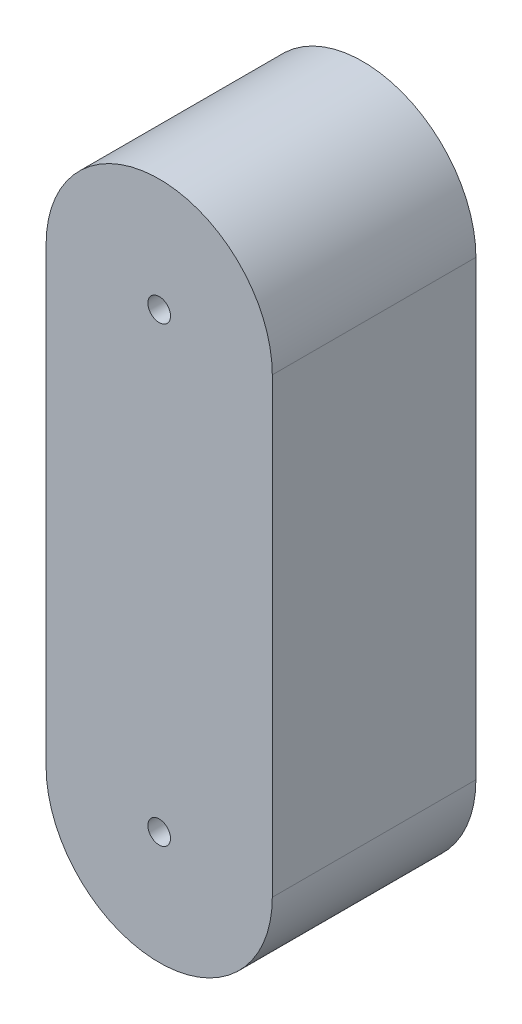
ISO-10303-21;
HEADER;
FILE_DESCRIPTION(('STEP AP214'),'2;1');
FILE_NAME('part.step','',(''),(''),'','','');
FILE_SCHEMA(('AUTOMOTIVE_DESIGN { 1 0 10303 214 1 1 1 1 }'));
ENDSEC;
DATA;
#1=APPLICATION_CONTEXT('core data for automotive mechanical design processes');
#2=APPLICATION_PROTOCOL_DEFINITION('international standard','automotive_design',2000,#1);
#3=PRODUCT_CONTEXT('',#1,'mechanical');
#4=PRODUCT('Part','Part','',(#3));
#5=PRODUCT_RELATED_PRODUCT_CATEGORY('part','',(#4));
#6=PRODUCT_DEFINITION_FORMATION('','',#4);
#7=PRODUCT_DEFINITION_CONTEXT('part definition',#1,'design');
#8=PRODUCT_DEFINITION('design','',#6,#7);
#9=PRODUCT_DEFINITION_SHAPE('','',#8);
#10=(LENGTH_UNIT() NAMED_UNIT(*) SI_UNIT(.MILLI.,.METRE.));
#11=(NAMED_UNIT(*) PLANE_ANGLE_UNIT() SI_UNIT($,.RADIAN.));
#12=(NAMED_UNIT(*) SI_UNIT($,.STERADIAN.) SOLID_ANGLE_UNIT());
#13=UNCERTAINTY_MEASURE_WITH_UNIT(LENGTH_MEASURE(1.E-05),#10,'distance_accuracy_value','');
#14=(GEOMETRIC_REPRESENTATION_CONTEXT(3) GLOBAL_UNCERTAINTY_ASSIGNED_CONTEXT((#13)) GLOBAL_UNIT_ASSIGNED_CONTEXT((#10,
#11,#12)) REPRESENTATION_CONTEXT('',''));
#15=CARTESIAN_POINT('',(0.,0.,0.));
#16=DIRECTION('',(0.,0.,1.));
#17=DIRECTION('',(1.,0.,0.));
#18=AXIS2_PLACEMENT_3D('',#15,#16,#17);
#19=CARTESIAN_POINT('',(0.,200.,90.));
#20=DIRECTION('',(0.,0.,1.));
#21=DIRECTION('',(1.,0.,0.));
#22=AXIS2_PLACEMENT_3D('',#19,#20,#21);
#23=PLANE('',#22);
#24=CARTESIAN_POINT('',(0.,0.,90.));
#25=DIRECTION('',(0.,0.,1.));
#26=DIRECTION('',(1.,0.,0.));
#27=AXIS2_PLACEMENT_3D('',#24,#25,#26);
#28=CIRCLE('',#27,5.);
#29=CARTESIAN_POINT('',(-5.,0.,90.));
#30=VERTEX_POINT('',#29);
#31=EDGE_CURVE('E106',#30,#30,#28,.T.);
#32=ORIENTED_EDGE('',*,*,#31,.F.);
#33=EDGE_LOOP('',(#32));
#34=FACE_BOUND('',#33,.T.);
#35=CARTESIAN_POINT('',(0.,200.,90.));
#36=DIRECTION('',(0.,0.,1.));
#37=DIRECTION('',(1.,0.,0.));
#38=AXIS2_PLACEMENT_3D('',#35,#36,#37);
#39=CIRCLE('',#38,50.);
#40=CARTESIAN_POINT('',(50.,200.,90.));
#41=VERTEX_POINT('',#40);
#42=CARTESIAN_POINT('',(-50.,200.,90.));
#43=VERTEX_POINT('',#42);
#44=EDGE_CURVE('E91',#41,#43,#39,.T.);
#45=ORIENTED_EDGE('',*,*,#44,.T.);
#46=DIRECTION('',(0.,-1.,0.));
#47=VECTOR('',#46,1.);
#48=CARTESIAN_POINT('',(-50.,200.,90.));
#49=LINE('',#48,#47);
#50=CARTESIAN_POINT('',(-50.,0.,90.));
#51=VERTEX_POINT('',#50);
#52=EDGE_CURVE('E86',#43,#51,#49,.T.);
#53=ORIENTED_EDGE('',*,*,#52,.T.);
#54=CARTESIAN_POINT('',(0.,0.,90.));
#55=DIRECTION('',(0.,0.,1.));
#56=DIRECTION('',(1.,0.,0.));
#57=AXIS2_PLACEMENT_3D('',#54,#55,#56);
#58=CIRCLE('',#57,50.);
#59=CARTESIAN_POINT('',(50.,0.,90.));
#60=VERTEX_POINT('',#59);
#61=EDGE_CURVE('E89',#51,#60,#58,.T.);
#62=ORIENTED_EDGE('',*,*,#61,.T.);
#63=DIRECTION('',(0.,1.,0.));
#64=VECTOR('',#63,1.);
#65=CARTESIAN_POINT('',(50.,0.,90.));
#66=LINE('',#65,#64);
#67=EDGE_CURVE('E56',#60,#41,#66,.T.);
#68=ORIENTED_EDGE('',*,*,#67,.T.);
#69=EDGE_LOOP('',(#45,#53,#62,#68));
#70=FACE_BOUND('',#69,.T.);
#71=CARTESIAN_POINT('',(0.,200.,90.));
#72=DIRECTION('',(0.,0.,1.));
#73=DIRECTION('',(1.,0.,0.));
#74=AXIS2_PLACEMENT_3D('',#71,#72,#73);
#75=CIRCLE('',#74,5.);
#76=CARTESIAN_POINT('',(-5.,200.,90.));
#77=VERTEX_POINT('',#76);
#78=EDGE_CURVE('E121',#77,#77,#75,.T.);
#79=ORIENTED_EDGE('',*,*,#78,.F.);
#80=EDGE_LOOP('',(#79));
#81=FACE_BOUND('',#80,.T.);
#82=ADVANCED_FACE('F39',(#34,#70,#81),#23,.T.);
#83=CARTESIAN_POINT('',(0.,200.,0.));
#84=DIRECTION('',(0.,0.,1.));
#85=DIRECTION('',(1.,0.,0.));
#86=AXIS2_PLACEMENT_3D('',#83,#84,#85);
#87=PLANE('',#86);
#88=CARTESIAN_POINT('',(0.,200.,0.));
#89=DIRECTION('',(0.,0.,1.));
#90=DIRECTION('',(1.,0.,0.));
#91=AXIS2_PLACEMENT_3D('',#88,#89,#90);
#92=CIRCLE('',#91,50.);
#93=CARTESIAN_POINT('',(50.,200.,0.));
#94=VERTEX_POINT('',#93);
#95=CARTESIAN_POINT('',(-50.,200.,0.));
#96=VERTEX_POINT('',#95);
#97=EDGE_CURVE('E103',#94,#96,#92,.T.);
#98=ORIENTED_EDGE('',*,*,#97,.F.);
#99=DIRECTION('',(0.,1.,0.));
#100=VECTOR('',#99,1.);
#101=CARTESIAN_POINT('',(50.,0.,0.));
#102=LINE('',#101,#100);
#103=CARTESIAN_POINT('',(50.,0.,0.));
#104=VERTEX_POINT('',#103);
#105=EDGE_CURVE('E79',#104,#94,#102,.T.);
#106=ORIENTED_EDGE('',*,*,#105,.F.);
#107=CARTESIAN_POINT('',(0.,0.,0.));
#108=DIRECTION('',(0.,0.,1.));
#109=DIRECTION('',(1.,0.,0.));
#110=AXIS2_PLACEMENT_3D('',#107,#108,#109);
#111=CIRCLE('',#110,50.);
#112=CARTESIAN_POINT('',(-50.,0.,0.));
#113=VERTEX_POINT('',#112);
#114=EDGE_CURVE('E73',#113,#104,#111,.T.);
#115=ORIENTED_EDGE('',*,*,#114,.F.);
#116=DIRECTION('',(0.,-1.,0.));
#117=VECTOR('',#116,1.);
#118=CARTESIAN_POINT('',(-50.,200.,0.));
#119=LINE('',#118,#117);
#120=EDGE_CURVE('E95',#96,#113,#119,.T.);
#121=ORIENTED_EDGE('',*,*,#120,.F.);
#122=EDGE_LOOP('',(#98,#106,#115,#121));
#123=FACE_BOUND('',#122,.T.);
#124=CARTESIAN_POINT('',(0.,0.,0.));
#125=DIRECTION('',(0.,0.,1.));
#126=DIRECTION('',(1.,0.,0.));
#127=AXIS2_PLACEMENT_3D('',#124,#125,#126);
#128=CIRCLE('',#127,5.);
#129=CARTESIAN_POINT('',(-5.,0.,0.));
#130=VERTEX_POINT('',#129);
#131=EDGE_CURVE('E118',#130,#130,#128,.T.);
#132=ORIENTED_EDGE('',*,*,#131,.T.);
#133=EDGE_LOOP('',(#132));
#134=FACE_BOUND('',#133,.T.);
#135=CARTESIAN_POINT('',(0.,200.,0.));
#136=DIRECTION('',(0.,0.,1.));
#137=DIRECTION('',(1.,0.,0.));
#138=AXIS2_PLACEMENT_3D('',#135,#136,#137);
#139=CIRCLE('',#138,5.);
#140=CARTESIAN_POINT('',(-5.,200.,0.));
#141=VERTEX_POINT('',#140);
#142=EDGE_CURVE('E124',#141,#141,#139,.T.);
#143=ORIENTED_EDGE('',*,*,#142,.T.);
#144=EDGE_LOOP('',(#143));
#145=FACE_BOUND('',#144,.T.);
#146=ADVANCED_FACE('F114',(#123,#134,#145),#87,.F.);
#147=CARTESIAN_POINT('',(0.,200.,90.));
#148=DIRECTION('',(0.,0.,-1.));
#149=DIRECTION('',(-1.,0.,0.));
#150=AXIS2_PLACEMENT_3D('',#147,#148,#149);
#151=CYLINDRICAL_SURFACE('',#150,50.);
#152=ORIENTED_EDGE('',*,*,#97,.T.);
#153=DIRECTION('',(0.,0.,-1.));
#154=VECTOR('',#153,1.);
#155=CARTESIAN_POINT('',(-50.,200.,90.));
#156=LINE('',#155,#154);
#157=EDGE_CURVE('E11',#43,#96,#156,.T.);
#158=ORIENTED_EDGE('',*,*,#157,.F.);
#159=ORIENTED_EDGE('',*,*,#44,.F.);
#160=DIRECTION('',(0.,0.,-1.));
#161=VECTOR('',#160,1.);
#162=CARTESIAN_POINT('',(50.,200.,90.));
#163=LINE('',#162,#161);
#164=EDGE_CURVE('E99',#41,#94,#163,.T.);
#165=ORIENTED_EDGE('',*,*,#164,.T.);
#166=EDGE_LOOP('',(#152,#158,#159,#165));
#167=FACE_BOUND('',#166,.T.);
#168=ADVANCED_FACE('F41',(#167),#151,.T.);
#169=CARTESIAN_POINT('',(-50.,200.,90.));
#170=DIRECTION('',(1.,0.,0.));
#171=DIRECTION('',(0.,0.,-1.));
#172=AXIS2_PLACEMENT_3D('',#169,#170,#171);
#173=PLANE('',#172);
#174=ORIENTED_EDGE('',*,*,#120,.T.);
#175=DIRECTION('',(0.,0.,-1.));
#176=VECTOR('',#175,1.);
#177=CARTESIAN_POINT('',(-50.,0.,90.));
#178=LINE('',#177,#176);
#179=EDGE_CURVE('E48',#51,#113,#178,.T.);
#180=ORIENTED_EDGE('',*,*,#179,.F.);
#181=ORIENTED_EDGE('',*,*,#52,.F.);
#182=ORIENTED_EDGE('',*,*,#157,.T.);
#183=EDGE_LOOP('',(#174,#180,#181,#182));
#184=FACE_BOUND('',#183,.T.);
#185=ADVANCED_FACE('F94',(#184),#173,.F.);
#186=CARTESIAN_POINT('',(0.,0.,90.));
#187=DIRECTION('',(0.,0.,-1.));
#188=DIRECTION('',(-1.,0.,0.));
#189=AXIS2_PLACEMENT_3D('',#186,#187,#188);
#190=CYLINDRICAL_SURFACE('',#189,50.);
#191=ORIENTED_EDGE('',*,*,#114,.T.);
#192=DIRECTION('',(0.,0.,-1.));
#193=VECTOR('',#192,1.);
#194=CARTESIAN_POINT('',(50.,0.,90.));
#195=LINE('',#194,#193);
#196=EDGE_CURVE('E96',#60,#104,#195,.T.);
#197=ORIENTED_EDGE('',*,*,#196,.F.);
#198=ORIENTED_EDGE('',*,*,#61,.F.);
#199=ORIENTED_EDGE('',*,*,#179,.T.);
#200=EDGE_LOOP('',(#191,#197,#198,#199));
#201=FACE_BOUND('',#200,.T.);
#202=ADVANCED_FACE('F97',(#201),#190,.T.);
#203=CARTESIAN_POINT('',(50.,0.,90.));
#204=DIRECTION('',(-1.,0.,0.));
#205=DIRECTION('',(0.,0.,1.));
#206=AXIS2_PLACEMENT_3D('',#203,#204,#205);
#207=PLANE('',#206);
#208=ORIENTED_EDGE('',*,*,#105,.T.);
#209=ORIENTED_EDGE('',*,*,#164,.F.);
#210=ORIENTED_EDGE('',*,*,#67,.F.);
#211=ORIENTED_EDGE('',*,*,#196,.T.);
#212=EDGE_LOOP('',(#208,#209,#210,#211));
#213=FACE_BOUND('',#212,.T.);
#214=ADVANCED_FACE('F111',(#213),#207,.F.);
#215=CARTESIAN_POINT('',(0.,0.,90.));
#216=DIRECTION('',(0.,0.,-1.));
#217=DIRECTION('',(-1.,0.,0.));
#218=AXIS2_PLACEMENT_3D('',#215,#216,#217);
#219=CYLINDRICAL_SURFACE('',#218,5.);
#220=CARTESIAN_POINT('',(-5.,0.,90.));
#221=CARTESIAN_POINT('',(-5.,0.,89.0625));
#222=CARTESIAN_POINT('',(-5.,0.,88.125));
#223=CARTESIAN_POINT('',(-5.,0.,86.25));
#224=CARTESIAN_POINT('',(-5.,0.,85.3125));
#225=CARTESIAN_POINT('',(-5.,0.,83.4375));
#226=CARTESIAN_POINT('',(-5.,0.,82.5));
#227=CARTESIAN_POINT('',(-5.,0.,80.625));
#228=CARTESIAN_POINT('',(-5.,0.,79.6875));
#229=CARTESIAN_POINT('',(-5.,0.,77.8125));
#230=CARTESIAN_POINT('',(-5.,0.,76.875));
#231=CARTESIAN_POINT('',(-5.,0.,75.));
#232=CARTESIAN_POINT('',(-5.,0.,74.0625));
#233=CARTESIAN_POINT('',(-5.,0.,72.1875));
#234=CARTESIAN_POINT('',(-5.,0.,71.25));
#235=CARTESIAN_POINT('',(-5.,0.,69.375));
#236=CARTESIAN_POINT('',(-5.,0.,68.4375));
#237=CARTESIAN_POINT('',(-5.,0.,66.5625));
#238=CARTESIAN_POINT('',(-5.,0.,65.625));
#239=CARTESIAN_POINT('',(-5.,0.,63.75));
#240=CARTESIAN_POINT('',(-5.,0.,62.8125));
#241=CARTESIAN_POINT('',(-5.,0.,60.9375));
#242=CARTESIAN_POINT('',(-5.,0.,60.));
#243=CARTESIAN_POINT('',(-5.,0.,58.125));
#244=CARTESIAN_POINT('',(-5.,0.,57.1875));
#245=CARTESIAN_POINT('',(-5.,0.,55.3125));
#246=CARTESIAN_POINT('',(-5.,0.,54.375));
#247=CARTESIAN_POINT('',(-5.,0.,52.5));
#248=CARTESIAN_POINT('',(-5.,0.,51.5625));
#249=CARTESIAN_POINT('',(-5.,0.,49.6875));
#250=CARTESIAN_POINT('',(-5.,0.,48.75));
#251=CARTESIAN_POINT('',(-5.,0.,46.875));
#252=CARTESIAN_POINT('',(-5.,0.,45.9375));
#253=CARTESIAN_POINT('',(-5.,0.,44.0625));
#254=CARTESIAN_POINT('',(-5.,0.,43.125));
#255=CARTESIAN_POINT('',(-5.,0.,41.25));
#256=CARTESIAN_POINT('',(-5.,0.,40.3125));
#257=CARTESIAN_POINT('',(-5.,0.,38.4375));
#258=CARTESIAN_POINT('',(-5.,0.,37.5));
#259=CARTESIAN_POINT('',(-5.,0.,35.625));
#260=CARTESIAN_POINT('',(-5.,0.,34.6875));
#261=CARTESIAN_POINT('',(-5.,0.,32.8125));
#262=CARTESIAN_POINT('',(-5.,0.,31.875));
#263=CARTESIAN_POINT('',(-5.,0.,30.));
#264=CARTESIAN_POINT('',(-5.,0.,29.0625));
#265=CARTESIAN_POINT('',(-5.,0.,27.1875));
#266=CARTESIAN_POINT('',(-5.,0.,26.25));
#267=CARTESIAN_POINT('',(-5.,0.,24.375));
#268=CARTESIAN_POINT('',(-5.,0.,23.4375));
#269=CARTESIAN_POINT('',(-5.,0.,21.5625));
#270=CARTESIAN_POINT('',(-5.,0.,20.625));
#271=CARTESIAN_POINT('',(-5.,0.,18.75));
#272=CARTESIAN_POINT('',(-5.,0.,17.8125));
#273=CARTESIAN_POINT('',(-5.,0.,15.9375));
#274=CARTESIAN_POINT('',(-5.,0.,15.));
#275=CARTESIAN_POINT('',(-5.,0.,13.125));
#276=CARTESIAN_POINT('',(-5.,0.,12.1875));
#277=CARTESIAN_POINT('',(-5.,0.,10.3125));
#278=CARTESIAN_POINT('',(-5.,0.,9.37499999999999));
#279=CARTESIAN_POINT('',(-5.,0.,7.49999999999999));
#280=CARTESIAN_POINT('',(-5.,0.,6.56249999999999));
#281=CARTESIAN_POINT('',(-5.,0.,4.68749999999999));
#282=CARTESIAN_POINT('',(-5.,0.,3.74999999999998));
#283=CARTESIAN_POINT('',(-5.,0.,1.87499999999998));
#284=CARTESIAN_POINT('',(-5.,0.,0.937499999999986));
#285=CARTESIAN_POINT('',(-5.,0.,0.));
#286=B_SPLINE_CURVE_WITH_KNOTS('',3,(#220,#221,#222,#223,#224,#225,#226,#227,#228,#229,#230,
#231,#232,#233,#234,#235,#236,#237,#238,#239,#240,#241,#242,#243,#244,#245,#246,#247,#248,#249,
#250,#251,#252,#253,#254,#255,#256,#257,#258,#259,#260,#261,#262,#263,#264,#265,#266,#267,#268,
#269,#270,#271,#272,#273,#274,#275,#276,#277,#278,#279,#280,#281,#282,#283,#284,#285),
.UNSPECIFIED.,.F.,.F.,(4,2,2,2,2,2,2,2,2,2,2,2,2,2,2,2,2,2,2,2,2,2,2,2,2,2,2,2,2,2,2,2,4),(0.,
2.8125,5.62499999999999,8.43749999999999,11.25,14.0625,16.875,19.6875,22.5,25.3125,28.125,
30.9375,33.75,36.5625,39.375,42.1875,45.,47.8125,50.625,53.4375,56.25,59.0625,61.875,64.6875,
67.5,70.3125,73.125,75.9375,78.75,81.5625,84.375,87.1875,90.),.UNSPECIFIED.);
#287=EDGE_CURVE('BSEAM141',#30,#130,#286,.T.);
#288=ORIENTED_EDGE('',*,*,#31,.T.);
#289=ORIENTED_EDGE('',*,*,#131,.F.);
#290=ORIENTED_EDGE('',*,*,#287,.T.);
#291=ORIENTED_EDGE('',*,*,#287,.F.);
#292=EDGE_LOOP('',(#288,#290,#289,#291));
#293=FACE_BOUND('',#292,.T.);
#294=ADVANCED_FACE('F141',(#293),#219,.F.);
#295=CARTESIAN_POINT('',(0.,200.,90.));
#296=DIRECTION('',(0.,0.,-1.));
#297=DIRECTION('',(-1.,0.,0.));
#298=AXIS2_PLACEMENT_3D('',#295,#296,#297);
#299=CYLINDRICAL_SURFACE('',#298,5.);
#300=CARTESIAN_POINT('',(-5.,200.,90.));
#301=CARTESIAN_POINT('',(-5.,200.,89.0625));
#302=CARTESIAN_POINT('',(-5.,200.,88.125));
#303=CARTESIAN_POINT('',(-5.,200.,86.25));
#304=CARTESIAN_POINT('',(-5.,200.,85.3125));
#305=CARTESIAN_POINT('',(-5.,200.,83.4375));
#306=CARTESIAN_POINT('',(-5.,200.,82.5));
#307=CARTESIAN_POINT('',(-5.,200.,80.625));
#308=CARTESIAN_POINT('',(-5.,200.,79.6875));
#309=CARTESIAN_POINT('',(-5.,200.,77.8125));
#310=CARTESIAN_POINT('',(-5.,200.,76.875));
#311=CARTESIAN_POINT('',(-5.,200.,75.));
#312=CARTESIAN_POINT('',(-5.,200.,74.0625));
#313=CARTESIAN_POINT('',(-5.,200.,72.1875));
#314=CARTESIAN_POINT('',(-5.,200.,71.25));
#315=CARTESIAN_POINT('',(-5.,200.,69.375));
#316=CARTESIAN_POINT('',(-5.,200.,68.4375));
#317=CARTESIAN_POINT('',(-5.,200.,66.5625));
#318=CARTESIAN_POINT('',(-5.,200.,65.625));
#319=CARTESIAN_POINT('',(-5.,200.,63.75));
#320=CARTESIAN_POINT('',(-5.,200.,62.8125));
#321=CARTESIAN_POINT('',(-5.,200.,60.9375));
#322=CARTESIAN_POINT('',(-5.,200.,60.));
#323=CARTESIAN_POINT('',(-5.,200.,58.125));
#324=CARTESIAN_POINT('',(-5.,200.,57.1875));
#325=CARTESIAN_POINT('',(-5.,200.,55.3125));
#326=CARTESIAN_POINT('',(-5.,200.,54.375));
#327=CARTESIAN_POINT('',(-5.,200.,52.5));
#328=CARTESIAN_POINT('',(-5.,200.,51.5625));
#329=CARTESIAN_POINT('',(-5.,200.,49.6875));
#330=CARTESIAN_POINT('',(-5.,200.,48.75));
#331=CARTESIAN_POINT('',(-5.,200.,46.875));
#332=CARTESIAN_POINT('',(-5.,200.,45.9375));
#333=CARTESIAN_POINT('',(-5.,200.,44.0625));
#334=CARTESIAN_POINT('',(-5.,200.,43.125));
#335=CARTESIAN_POINT('',(-5.,200.,41.25));
#336=CARTESIAN_POINT('',(-5.,200.,40.3125));
#337=CARTESIAN_POINT('',(-5.,200.,38.4375));
#338=CARTESIAN_POINT('',(-5.,200.,37.5));
#339=CARTESIAN_POINT('',(-5.,200.,35.625));
#340=CARTESIAN_POINT('',(-5.,200.,34.6875));
#341=CARTESIAN_POINT('',(-5.,200.,32.8125));
#342=CARTESIAN_POINT('',(-5.,200.,31.875));
#343=CARTESIAN_POINT('',(-5.,200.,30.));
#344=CARTESIAN_POINT('',(-5.,200.,29.0625));
#345=CARTESIAN_POINT('',(-5.,200.,27.1875));
#346=CARTESIAN_POINT('',(-5.,200.,26.25));
#347=CARTESIAN_POINT('',(-5.,200.,24.375));
#348=CARTESIAN_POINT('',(-5.,200.,23.4375));
#349=CARTESIAN_POINT('',(-5.,200.,21.5625));
#350=CARTESIAN_POINT('',(-5.,200.,20.625));
#351=CARTESIAN_POINT('',(-5.,200.,18.75));
#352=CARTESIAN_POINT('',(-5.,200.,17.8125));
#353=CARTESIAN_POINT('',(-5.,200.,15.9375));
#354=CARTESIAN_POINT('',(-5.,200.,15.));
#355=CARTESIAN_POINT('',(-5.,200.,13.125));
#356=CARTESIAN_POINT('',(-5.,200.,12.1875));
#357=CARTESIAN_POINT('',(-5.,200.,10.3125));
#358=CARTESIAN_POINT('',(-5.,200.,9.37499999999999));
#359=CARTESIAN_POINT('',(-5.,200.,7.49999999999999));
#360=CARTESIAN_POINT('',(-5.,200.,6.56249999999999));
#361=CARTESIAN_POINT('',(-5.,200.,4.68749999999999));
#362=CARTESIAN_POINT('',(-5.,200.,3.74999999999998));
#363=CARTESIAN_POINT('',(-5.,200.,1.87499999999998));
#364=CARTESIAN_POINT('',(-5.,200.,0.937499999999986));
#365=CARTESIAN_POINT('',(-5.,200.,0.));
#366=B_SPLINE_CURVE_WITH_KNOTS('',3,(#300,#301,#302,#303,#304,#305,#306,#307,#308,#309,#310,
#311,#312,#313,#314,#315,#316,#317,#318,#319,#320,#321,#322,#323,#324,#325,#326,#327,#328,#329,
#330,#331,#332,#333,#334,#335,#336,#337,#338,#339,#340,#341,#342,#343,#344,#345,#346,#347,#348,
#349,#350,#351,#352,#353,#354,#355,#356,#357,#358,#359,#360,#361,#362,#363,#364,#365),
.UNSPECIFIED.,.F.,.F.,(4,2,2,2,2,2,2,2,2,2,2,2,2,2,2,2,2,2,2,2,2,2,2,2,2,2,2,2,2,2,2,2,4),(0.,
2.8125,5.62499999999999,8.43749999999999,11.25,14.0625,16.875,19.6875,22.5,25.3125,28.125,
30.9375,33.75,36.5625,39.375,42.1875,45.,47.8125,50.625,53.4375,56.25,59.0625,61.875,64.6875,
67.5,70.3125,73.125,75.9375,78.75,81.5625,84.375,87.1875,90.),.UNSPECIFIED.);
#367=EDGE_CURVE('BSEAM130',#77,#141,#366,.T.);
#368=ORIENTED_EDGE('',*,*,#78,.T.);
#369=ORIENTED_EDGE('',*,*,#142,.F.);
#370=ORIENTED_EDGE('',*,*,#367,.T.);
#371=ORIENTED_EDGE('',*,*,#367,.F.);
#372=EDGE_LOOP('',(#368,#370,#369,#371));
#373=FACE_BOUND('',#372,.T.);
#374=ADVANCED_FACE('F130',(#373),#299,.F.);
#375=CLOSED_SHELL('',(#82,#146,#168,#185,#202,#214,#294,#374));
#376=MANIFOLD_SOLID_BREP('B2',#375);
#377=ADVANCED_BREP_SHAPE_REPRESENTATION('',(#18,#376),#14);
#378=SHAPE_DEFINITION_REPRESENTATION(#9,#377);
ENDSEC;
END-ISO-10303-21;
